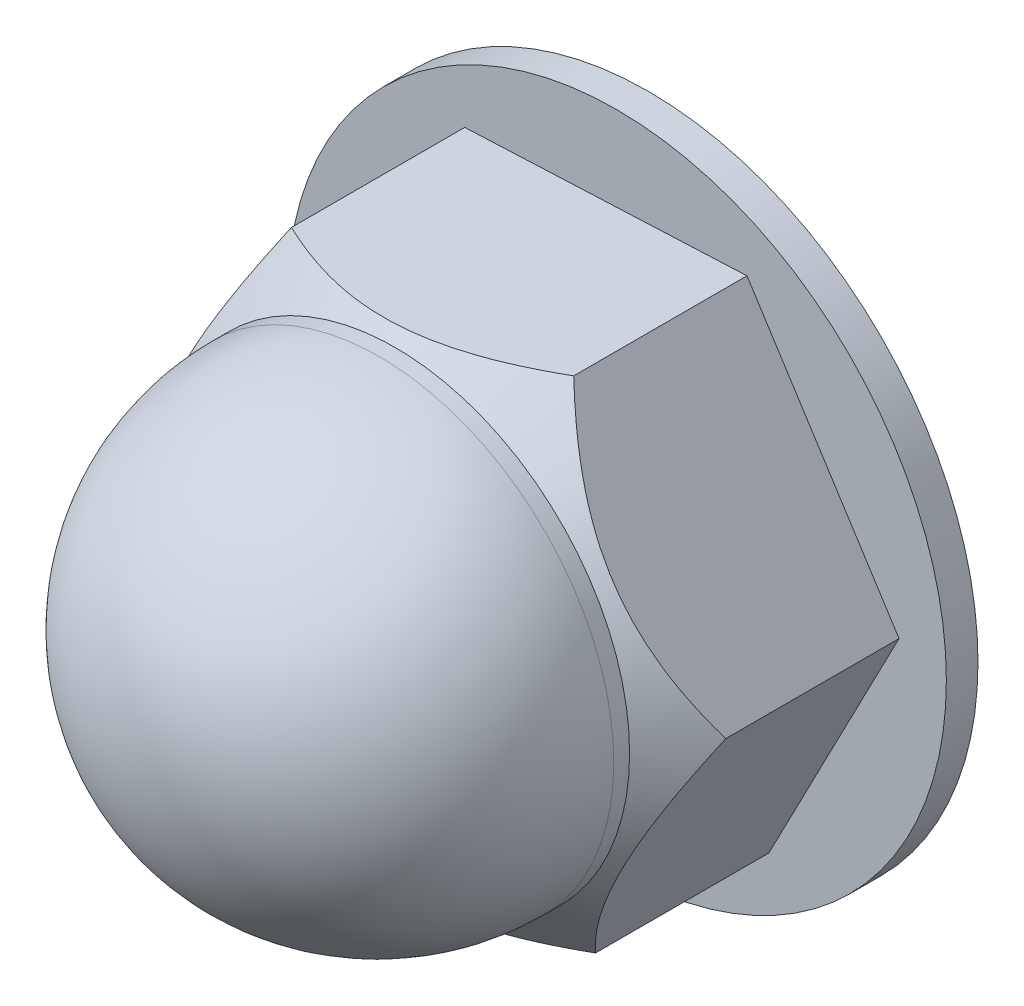
ISO-10303-21;
HEADER;
FILE_DESCRIPTION(('STEP AP214'),'2;1');
FILE_NAME('part.step','',(''),(''),'','','');
FILE_SCHEMA(('AUTOMOTIVE_DESIGN { 1 0 10303 214 1 1 1 1 }'));
ENDSEC;
DATA;
#1=APPLICATION_CONTEXT('core data for automotive mechanical design processes');
#2=APPLICATION_PROTOCOL_DEFINITION('international standard','automotive_design',2000,#1);
#3=PRODUCT_CONTEXT('',#1,'mechanical');
#4=PRODUCT('Part','Part','',(#3));
#5=PRODUCT_RELATED_PRODUCT_CATEGORY('part','',(#4));
#6=PRODUCT_DEFINITION_FORMATION('','',#4);
#7=PRODUCT_DEFINITION_CONTEXT('part definition',#1,'design');
#8=PRODUCT_DEFINITION('design','',#6,#7);
#9=PRODUCT_DEFINITION_SHAPE('','',#8);
#10=(LENGTH_UNIT() NAMED_UNIT(*) SI_UNIT(.MILLI.,.METRE.));
#11=(NAMED_UNIT(*) PLANE_ANGLE_UNIT() SI_UNIT($,.RADIAN.));
#12=(NAMED_UNIT(*) SI_UNIT($,.STERADIAN.) SOLID_ANGLE_UNIT());
#13=UNCERTAINTY_MEASURE_WITH_UNIT(LENGTH_MEASURE(1.E-05),#10,'distance_accuracy_value','');
#14=(GEOMETRIC_REPRESENTATION_CONTEXT(3) GLOBAL_UNCERTAINTY_ASSIGNED_CONTEXT((#13)) GLOBAL_UNIT_ASSIGNED_CONTEXT((#10,
#11,#12)) REPRESENTATION_CONTEXT('',''));
#15=CARTESIAN_POINT('',(0.,0.,0.));
#16=DIRECTION('',(0.,0.,1.));
#17=DIRECTION('',(1.,0.,0.));
#18=AXIS2_PLACEMENT_3D('',#15,#16,#17);
#19=CARTESIAN_POINT('',(92.2559326543257,118.129399506739,16.));
#20=DIRECTION('',(-0.842824038215276,-0.538189223792613,0.));
#21=DIRECTION('',(0.538189223792613,-0.842824038215276,0.));
#22=AXIS2_PLACEMENT_3D('',#19,#20,#21);
#23=PLANE('',#22);
#24=CARTESIAN_POINT('',(92.2560603652593,118.129199506739,12.9518948181768));
#25=CARTESIAN_POINT('',(92.0908191401322,118.387973318038,13.1053873037913));
#26=CARTESIAN_POINT('',(91.9242838044926,118.648773753804,13.2541959734682));
#27=CARTESIAN_POINT('',(91.5884235147349,119.174743270055,13.5409579014863));
#28=CARTESIAN_POINT('',(91.4190970973284,119.439914642104,13.6789052314778));
#29=CARTESIAN_POINT('',(91.0766546254393,119.976192096676,13.9430408864324));
#30=CARTESIAN_POINT('',(90.9035224240984,120.247323465772,14.0691573628248));
#31=CARTESIAN_POINT('',(90.5544143146195,120.794039552971,14.3068921529873));
#32=CARTESIAN_POINT('',(90.378438845875,121.069623582969,14.4185126832892));
#33=CARTESIAN_POINT('',(90.0264740872888,121.620813287308,14.6237242431107));
#34=CARTESIAN_POINT('',(89.8505280407439,121.896351241064,14.7175699027357));
#35=CARTESIAN_POINT('',(89.4961679232253,122.451292165233,14.8874679937733));
#36=CARTESIAN_POINT('',(89.3177541201372,122.730694716129,14.9635223407008));
#37=CARTESIAN_POINT('',(88.9592292806824,123.292157747403,15.0959268965302));
#38=CARTESIAN_POINT('',(88.7791230181467,123.574210751788,15.1523214555356));
#39=CARTESIAN_POINT('',(88.417375896274,124.14071999536,15.2441531198325));
#40=CARTESIAN_POINT('',(88.2357352703561,124.425175869004,15.279593356625));
#41=CARTESIAN_POINT('',(87.9234034024532,124.91429901479,15.3215635846673));
#42=CARTESIAN_POINT('',(87.7929145229036,125.118649379944,15.333449235125));
#43=CARTESIAN_POINT('',(87.5317693061736,125.527612355037,15.345810979035));
#44=CARTESIAN_POINT('',(87.4011129604242,125.732224978394,15.3462864632732));
#45=CARTESIAN_POINT('',(87.1398982771897,126.141296740577,15.3358112799266));
#46=CARTESIAN_POINT('',(87.0093399742779,126.34575582526,15.3248576237133));
#47=CARTESIAN_POINT('',(86.7486330792871,126.754032372453,15.2916977696348));
#48=CARTESIAN_POINT('',(86.6184845345875,126.957849760766,15.269490315368));
#49=CARTESIAN_POINT('',(86.2288056721566,127.568101133186,15.1863810595753));
#50=CARTESIAN_POINT('',(85.9702503425814,127.973008250128,15.1090015050792));
#51=CARTESIAN_POINT('',(85.4576259380617,128.775796844928,14.9145309062929));
#52=CARTESIAN_POINT('',(85.2035565206526,129.173678859098,14.7974429073457));
#53=CARTESIAN_POINT('',(84.7525448849096,129.879979601132,14.5565698588894));
#54=CARTESIAN_POINT('',(84.5546059635394,130.189959202458,14.4391213669472));
#55=CARTESIAN_POINT('',(84.1622831355932,130.804351121723,14.1852991119808));
#56=CARTESIAN_POINT('',(83.967899336656,131.108763271095,14.0489247770066));
#57=CARTESIAN_POINT('',(83.5832963593686,131.711065621452,13.7603079237186));
#58=CARTESIAN_POINT('',(83.3930662447098,132.008972949096,13.6081153103363));
#59=CARTESIAN_POINT('',(83.0161282065559,132.599271724005,13.2898595353694));
#60=CARTESIAN_POINT('',(82.8294182087122,132.891666419775,13.1238048769118));
#61=CARTESIAN_POINT('',(82.6443373641435,133.181509801842,12.9518948181768));
#62=B_SPLINE_CURVE_WITH_KNOTS('',3,(#24,#25,#26,#27,#28,#29,#30,#31,#32,#33,#34,#35,#36,#37,#38,
#39,#40,#41,#42,#43,#44,#45,#46,#47,#48,#49,#50,#51,#52,#53,#54,#55,#56,#57,#58,#59,#60,#61),
.UNSPECIFIED.,.F.,.F.,(4,2,2,2,2,2,2,2,2,2,2,2,2,2,2,2,2,2,4),(0.,1.02982828983487,
2.06021484027422,3.09650089113723,4.13262829956334,5.15255408434797,6.17237000748294,
7.18987023147171,8.2072183575348,8.93521979529388,9.66326010257611,10.3914908342777,
11.1198028853648,12.5775835180413,14.0352523750317,15.1929541840402,16.3506909870977,
17.5048801711571,18.6583664936043),.UNSPECIFIED.);
#63=CARTESIAN_POINT('',(92.2559326543257,118.129399506739,12.9520134680871));
#64=VERTEX_POINT('',#63);
#65=CARTESIAN_POINT('',(82.6444650750771,133.181309801842,12.9520134680871));
#66=VERTEX_POINT('',#65);
#67=EDGE_CURVE('E87',#64,#66,#62,.T.);
#68=ORIENTED_EDGE('',*,*,#67,.F.);
#69=DIRECTION('',(0.,0.,-1.));
#70=VECTOR('',#69,1.);
#71=CARTESIAN_POINT('',(92.2559326543257,118.129399506739,16.));
#72=LINE('',#71,#70);
#73=CARTESIAN_POINT('',(92.2559326543257,118.129399506739,2.));
#74=VERTEX_POINT('',#73);
#75=EDGE_CURVE('E97',#64,#74,#72,.T.);
#76=ORIENTED_EDGE('',*,*,#75,.T.);
#77=DIRECTION('',(-0.538189223792613,0.842824038215276,0.));
#78=VECTOR('',#77,1.);
#79=CARTESIAN_POINT('',(92.2559326543257,118.129399506739,2.));
#80=LINE('',#79,#78);
#81=CARTESIAN_POINT('',(82.6444650750771,133.181309801842,2.));
#82=VERTEX_POINT('',#81);
#83=EDGE_CURVE('E100',#74,#82,#80,.T.);
#84=ORIENTED_EDGE('',*,*,#83,.T.);
#85=DIRECTION('',(0.,0.,-1.));
#86=VECTOR('',#85,1.);
#87=CARTESIAN_POINT('',(82.6444650750771,133.181309801842,16.));
#88=LINE('',#87,#86);
#89=EDGE_CURVE('E99',#66,#82,#88,.T.);
#90=ORIENTED_EDGE('',*,*,#89,.F.);
#91=EDGE_LOOP('',(#68,#76,#84,#90));
#92=FACE_BOUND('',#91,.T.);
#93=ADVANCED_FACE('F32',(#92),#23,.F.);
#94=CARTESIAN_POINT('',(82.6444650750771,133.181309801842,16.));
#95=DIRECTION('',(0.0446735207397933,-0.999001639910922,0.));
#96=DIRECTION('',(0.999001639910922,0.0446735207397933,0.));
#97=AXIS2_PLACEMENT_3D('',#94,#95,#96);
#98=PLANE('',#97);
#99=CARTESIAN_POINT('',(82.6446650750771,133.181318745475,12.9519133673097));
#100=CARTESIAN_POINT('',(82.3379408851219,133.167602602364,13.1054048161147));
#101=CARTESIAN_POINT('',(82.0288145458766,133.153779039543,13.2542124616859));
#102=CARTESIAN_POINT('',(81.4053837371677,133.125900357416,13.5409723793514));
#103=CARTESIAN_POINT('',(81.0910765515464,133.111845116649,13.6789187231605));
#104=CARTESIAN_POINT('',(80.4554278212869,133.083420071484,13.9430524437367));
#105=CARTESIAN_POINT('',(80.1340563050066,133.069048926809,14.0691679731168));
#106=CARTESIAN_POINT('',(79.4860347526251,133.040070591736,14.3069009437252));
#107=CARTESIAN_POINT('',(79.1593855321252,133.02546343781,14.4185206014587));
#108=CARTESIAN_POINT('',(78.5060614164831,132.996247981835,14.6237305420618));
#109=CARTESIAN_POINT('',(78.1794667891593,132.981643269215,14.7175754510528));
#110=CARTESIAN_POINT('',(77.521696368381,132.952228982631,14.8874721545236));
#111=CARTESIAN_POINT('',(77.1905210721711,132.937419430902,14.9635258644811));
#112=CARTESIAN_POINT('',(76.5250200621294,132.907659446547,15.0959292884326));
#113=CARTESIAN_POINT('',(76.1907032094024,132.892709410173,15.1523233516759));
#114=CARTESIAN_POINT('',(75.5192209790774,132.862681956619,15.2441541852588));
#115=CARTESIAN_POINT('',(75.182056034745,132.847604558813,15.2795940870204));
#116=CARTESIAN_POINT('',(74.6022984717679,132.821678864121,15.3215639613534));
#117=CARTESIAN_POINT('',(74.3600814755725,132.810847364381,15.3334495057251));
#118=CARTESIAN_POINT('',(73.8753366486167,132.789170464949,15.3458110418494));
#119=CARTESIAN_POINT('',(73.6328088019506,132.778325064546,15.346286424381));
#120=CARTESIAN_POINT('',(73.147935039398,132.756642399351,15.3358110436337));
#121=CARTESIAN_POINT('',(72.905589187688,132.745805137428,15.3248572917539));
#122=CARTESIAN_POINT('',(72.4216580047502,132.724164622665,15.2916972537349));
#123=CARTESIAN_POINT('',(72.1800727614693,132.713361373756,15.2694897111956));
#124=CARTESIAN_POINT('',(71.4567403471178,132.681015275088,15.1863802041511));
#125=CARTESIAN_POINT('',(70.9768029808247,132.659553356478,15.1090005002181));
#126=CARTESIAN_POINT('',(70.0252557625002,132.61700191042,14.9145296418091));
#127=CARTESIAN_POINT('',(69.5536452747695,132.595912354544,14.7974415327056));
#128=CARTESIAN_POINT('',(68.7164689990687,132.558475367235,14.5565693714911));
#129=CARTESIAN_POINT('',(68.349053040999,132.542045199588,14.4391220832855));
#130=CARTESIAN_POINT('',(67.6208199094126,132.509479949835,14.185302604512));
#131=CARTESIAN_POINT('',(67.2600029356193,132.49334487666,14.0489298422187));
#132=CARTESIAN_POINT('',(66.5460993349473,132.461420417243,13.7603164224897));
#133=CARTESIAN_POINT('',(66.1929924080684,132.445630123222,13.6081256694125));
#134=CARTESIAN_POINT('',(65.4933164107028,132.414341896126,13.2898738374285));
#135=CARTESIAN_POINT('',(65.1467434899964,132.398843790875,13.1238212611334));
#136=CARTESIAN_POINT('',(64.8031945944091,132.38348091448,12.9519133673097));
#137=B_SPLINE_CURVE_WITH_KNOTS('',3,(#99,#100,#101,#102,#103,#104,#105,#106,#107,#108,#109,#110,
#111,#112,#113,#114,#115,#116,#117,#118,#119,#120,#121,#122,#123,#124,#125,#126,#127,#128,#129,
#130,#131,#132,#133,#134,#135,#136),.UNSPECIFIED.,.F.,.F.,(4,2,2,2,2,2,2,2,2,2,2,2,2,2,2,2,2,2,
4),(0.,1.02982389792767,2.0602060500016,3.09648760515516,4.13261051963591,5.15253203954637,
6.1723436996982,7.18983969856086,8.20718360280355,8.93518487167522,9.66322501051785,
10.3914555720774,11.1197674529627,12.5775477216536,14.0352162135011,15.192906323539,
16.3506314142025,17.5048088992358,18.6582835609205),.UNSPECIFIED.);
#138=CARTESIAN_POINT('',(64.8033945944091,132.383489858113,12.9520134680871));
#139=VERTEX_POINT('',#138);
#140=EDGE_CURVE('E101',#66,#139,#137,.T.);
#141=ORIENTED_EDGE('',*,*,#140,.F.);
#142=ORIENTED_EDGE('',*,*,#89,.T.);
#143=DIRECTION('',(-0.999001639910922,-0.0446735207397933,0.));
#144=VECTOR('',#143,1.);
#145=CARTESIAN_POINT('',(82.6444650750771,133.181309801842,2.));
#146=LINE('',#145,#144);
#147=CARTESIAN_POINT('',(64.8033945944091,132.383489858113,2.));
#148=VERTEX_POINT('',#147);
#149=EDGE_CURVE('E207',#82,#148,#146,.T.);
#150=ORIENTED_EDGE('',*,*,#149,.T.);
#151=DIRECTION('',(0.,0.,-1.));
#152=VECTOR('',#151,1.);
#153=CARTESIAN_POINT('',(64.8033945944091,132.383489858113,16.));
#154=LINE('',#153,#152);
#155=EDGE_CURVE('E118',#139,#148,#154,.T.);
#156=ORIENTED_EDGE('',*,*,#155,.F.);
#157=EDGE_LOOP('',(#141,#142,#150,#156));
#158=FACE_BOUND('',#157,.T.);
#159=ADVANCED_FACE('F180',(#158),#98,.F.);
#160=CARTESIAN_POINT('',(64.8033945944091,132.383489858113,16.));
#161=DIRECTION('',(0.887497558955069,-0.460812416118308,0.));
#162=DIRECTION('',(0.460812416118308,0.88749755895507,0.));
#163=AXIS2_PLACEMENT_3D('',#160,#161,#162);
#164=PLANE('',#163);
#165=CARTESIAN_POINT('',(64.8034984397463,132.383689858113,12.9519007906545));
#166=CARTESIAN_POINT('',(64.6620145237929,132.11120017327,13.1053929424352));
#167=CARTESIAN_POINT('',(64.5194225569392,131.836576447687,13.2542012823687));
#168=CARTESIAN_POINT('',(64.2318500805587,131.282728804083,13.5409625630899));
#169=CARTESIAN_POINT('',(64.0868683181297,131.003502473047,13.6789095755486));
#170=CARTESIAN_POINT('',(63.7936600121053,130.438800553654,13.9430446076686));
#171=CARTESIAN_POINT('',(63.6454196432149,130.153298338594,14.0691607791403));
#172=CARTESIAN_POINT('',(63.3465040524323,129.577604525073,14.3068949834396));
#173=CARTESIAN_POINT('',(63.1958292067591,129.287413651187,14.4185152327904));
#174=CARTESIAN_POINT('',(62.8944676785067,128.707009106232,14.6237262712533));
#175=CARTESIAN_POINT('',(62.7438180217932,128.416866744798,14.7175716891879));
#176=CARTESIAN_POINT('',(62.4404055252006,127.832512155677,14.8874693334547));
#177=CARTESIAN_POINT('',(62.2876429146907,127.538300369742,14.9635234752896));
#178=CARTESIAN_POINT('',(61.9806644808272,126.94707799557,15.0959276666755));
#179=CARTESIAN_POINT('',(61.8264527449276,126.650075279527,15.1523220660549));
#180=CARTESIAN_POINT('',(61.5167153144734,126.053539240502,15.2441534628777));
#181=CARTESIAN_POINT('',(61.3611898197767,125.754006302433,15.2795935917968));
#182=CARTESIAN_POINT('',(61.0937628978896,125.238957809658,15.321563705952));
#183=CARTESIAN_POINT('',(60.982034737754,125.023775957089,15.3334493222524));
#184=CARTESIAN_POINT('',(60.7584350363805,124.593136108399,15.3458109992601));
#185=CARTESIAN_POINT('',(60.6465634878057,124.377678098146,15.3462864507511));
#186=CARTESIAN_POINT('',(60.4229043087915,123.946923699024,15.335811203846));
#187=CARTESIAN_POINT('',(60.3111167079548,123.731627367168,15.3248575168303));
#188=CARTESIAN_POINT('',(60.0878923125545,123.301710335665,15.2916976035273));
#189=CARTESIAN_POINT('',(59.9764555585583,123.08708971415,15.2694901208388));
#190=CARTESIAN_POINT('',(59.6428018294674,122.444492293275,15.1863807841492));
#191=CARTESIAN_POINT('',(59.4214196667831,122.018123293426,15.1090011815381));
#192=CARTESIAN_POINT('',(58.9824965967682,121.172783325183,14.9145304991599));
#193=CARTESIAN_POINT('',(58.7649553962089,120.753811792049,14.7974424647454));
#194=CARTESIAN_POINT('',(58.3787874120814,120.010075010504,14.5565697019649));
#195=CARTESIAN_POINT('',(58.2093072146755,119.683666137332,14.4391215976029));
#196=CARTESIAN_POINT('',(57.8733907017516,119.036710728135,14.185300236518));
#197=CARTESIAN_POINT('',(57.7069544783851,118.716164369589,14.0489264079173));
#198=CARTESIAN_POINT('',(57.3776478740921,118.081939254911,13.7603106601704));
#199=CARTESIAN_POINT('',(57.2147681292384,117.768242464406,13.6081186457711));
#200=CARTESIAN_POINT('',(56.8920244169183,117.146657092934,13.28986414037));
#201=CARTESIAN_POINT('',(56.7321586733738,116.838765091343,13.1238101523292));
#202=CARTESIAN_POINT('',(56.5736878476526,116.533559619282,12.9519007906545));
#203=B_SPLINE_CURVE_WITH_KNOTS('',3,(#165,#166,#167,#168,#169,#170,#171,#172,#173,#174,#175,
#176,#177,#178,#179,#180,#181,#182,#183,#184,#185,#186,#187,#188,#189,#190,#191,#192,#193,#194,
#195,#196,#197,#198,#199,#200,#201,#202),.UNSPECIFIED.,.F.,.F.,(4,2,2,2,2,2,2,2,2,2,2,2,2,2,2,2,
2,2,4),(0.,1.02982687571998,2.060212009965,3.09649661329056,4.13262257474722,5.15254698631947,
6.17236153685091,7.18986040042548,8.20720716713878,8.93520855051842,9.6632488035654,
10.3914794804836,11.119791476768,12.5775719922464,14.0352407316659,15.1929387738334,
16.3506718057277,17.5048572229281,18.6583397908366),.UNSPECIFIED.);
#204=CARTESIAN_POINT('',(56.5737916929897,116.533759619282,12.9520134680871));
#205=VERTEX_POINT('',#204);
#206=EDGE_CURVE('E162',#139,#205,#203,.T.);
#207=ORIENTED_EDGE('',*,*,#206,.F.);
#208=ORIENTED_EDGE('',*,*,#155,.T.);
#209=DIRECTION('',(-0.460812416118308,-0.887497558955069,0.));
#210=VECTOR('',#209,1.);
#211=CARTESIAN_POINT('',(64.8033945944091,132.383489858113,2.));
#212=LINE('',#211,#210);
#213=CARTESIAN_POINT('',(56.5737916929897,116.533759619282,2.));
#214=VERTEX_POINT('',#213);
#215=EDGE_CURVE('E210',#148,#214,#212,.T.);
#216=ORIENTED_EDGE('',*,*,#215,.T.);
#217=DIRECTION('',(0.,0.,-1.));
#218=VECTOR('',#217,1.);
#219=CARTESIAN_POINT('',(56.5737916929897,116.533759619282,16.));
#220=LINE('',#219,#218);
#221=EDGE_CURVE('E116',#205,#214,#220,.T.);
#222=ORIENTED_EDGE('',*,*,#221,.F.);
#223=EDGE_LOOP('',(#207,#208,#216,#222));
#224=FACE_BOUND('',#223,.T.);
#225=ADVANCED_FACE('F183',(#224),#164,.F.);
#226=CARTESIAN_POINT('',(56.5737916929897,116.533759619282,16.));
#227=DIRECTION('',(0.842824038215275,0.538189223792613,0.));
#228=DIRECTION('',(-0.538189223792614,0.842824038215276,0.));
#229=AXIS2_PLACEMENT_3D('',#226,#227,#228);
#230=PLANE('',#229);
#231=CARTESIAN_POINT('',(56.5736639820562,116.533959619282,12.9518948181768));
#232=CARTESIAN_POINT('',(56.7389052071832,116.275185807982,13.1053873037913));
#233=CARTESIAN_POINT('',(56.9054405428228,116.014385372217,13.2541959734683));
#234=CARTESIAN_POINT('',(57.2413008325805,115.488415855966,13.5409579014863));
#235=CARTESIAN_POINT('',(57.4106272499871,115.223244483917,13.6789052314778));
#236=CARTESIAN_POINT('',(57.7530697218762,114.686967029344,13.9430408864325));
#237=CARTESIAN_POINT('',(57.9262019232171,114.415835660249,14.0691573628248));
#238=CARTESIAN_POINT('',(58.275310032696,113.86911957305,14.3068921529873));
#239=CARTESIAN_POINT('',(58.4512855014405,113.593535543052,14.4185126832892));
#240=CARTESIAN_POINT('',(58.8032502600266,113.042345838712,14.6237242431107));
#241=CARTESIAN_POINT('',(58.9791963065716,112.766807884957,14.7175699027357));
#242=CARTESIAN_POINT('',(59.3335564240902,112.211866960787,14.8874679937733));
#243=CARTESIAN_POINT('',(59.5119702271783,111.932464409892,14.9635223407008));
#244=CARTESIAN_POINT('',(59.8704950666331,111.371001378618,15.0959268965302));
#245=CARTESIAN_POINT('',(60.0506013291688,111.088948374233,15.1523214555356));
#246=CARTESIAN_POINT('',(60.4123484510415,110.522439130661,15.2441531198325));
#247=CARTESIAN_POINT('',(60.5939890769594,110.237983257016,15.279593356625));
#248=CARTESIAN_POINT('',(60.9063209448623,109.748860111231,15.3215635846673));
#249=CARTESIAN_POINT('',(61.0368098244119,109.544509746076,15.333449235125));
#250=CARTESIAN_POINT('',(61.2979550411419,109.135546770984,15.345810979035));
#251=CARTESIAN_POINT('',(61.4286113868912,108.930934147626,15.3462864632732));
#252=CARTESIAN_POINT('',(61.6898260701257,108.521862385443,15.3358112799266));
#253=CARTESIAN_POINT('',(61.8203843730376,108.31740330076,15.3248576237133));
#254=CARTESIAN_POINT('',(62.0810912680283,107.909126753567,15.2916977696348));
#255=CARTESIAN_POINT('',(62.2112398127279,107.705309365254,15.269490315368));
#256=CARTESIAN_POINT('',(62.6009186751589,107.095057992834,15.1863810595753));
#257=CARTESIAN_POINT('',(62.8594740047341,106.690150875893,15.1090015050792));
#258=CARTESIAN_POINT('',(63.3720984092538,105.887362281093,14.9145309062928));
#259=CARTESIAN_POINT('',(63.6261678266628,105.489480266922,14.7974429073457));
#260=CARTESIAN_POINT('',(64.0771794624059,104.783179524889,14.5565698588894));
#261=CARTESIAN_POINT('',(64.275118383776,104.473199923563,14.4391213669472));
#262=CARTESIAN_POINT('',(64.6674412117223,103.858808004298,14.1852991119808));
#263=CARTESIAN_POINT('',(64.8618250106595,103.554395854925,14.0489247770066));
#264=CARTESIAN_POINT('',(65.2464279879469,102.952093504568,13.7603079237186));
#265=CARTESIAN_POINT('',(65.4366581026057,102.654186176924,13.6081153103363));
#266=CARTESIAN_POINT('',(65.8135961407595,102.063887402016,13.2898595353694));
#267=CARTESIAN_POINT('',(66.0003061386033,101.771492706245,13.1238048769118));
#268=CARTESIAN_POINT('',(66.185386983172,101.481649324179,12.9518948181768));
#269=B_SPLINE_CURVE_WITH_KNOTS('',3,(#231,#232,#233,#234,#235,#236,#237,#238,#239,#240,#241,
#242,#243,#244,#245,#246,#247,#248,#249,#250,#251,#252,#253,#254,#255,#256,#257,#258,#259,#260,
#261,#262,#263,#264,#265,#266,#267,#268),.UNSPECIFIED.,.F.,.F.,(4,2,2,2,2,2,2,2,2,2,2,2,2,2,2,2,
2,2,4),(0.,1.02982828983486,2.0602148402742,3.0965008911372,4.13262829956332,5.15255408434796,
6.17237000748293,7.1898702314717,8.20721835753479,8.93521979529387,9.66326010257609,
10.3914908342777,11.1198028853647,12.5775835180414,14.0352523750317,15.1929541840401,
16.3506909870976,17.5048801711571,18.6583664936043),.UNSPECIFIED.);
#270=CARTESIAN_POINT('',(66.1852592722384,101.481849324179,12.9520134680871));
#271=VERTEX_POINT('',#270);
#272=EDGE_CURVE('E155',#205,#271,#269,.T.);
#273=ORIENTED_EDGE('',*,*,#272,.F.);
#274=ORIENTED_EDGE('',*,*,#221,.T.);
#275=DIRECTION('',(0.538189223792613,-0.842824038215275,0.));
#276=VECTOR('',#275,1.);
#277=CARTESIAN_POINT('',(56.5737916929897,116.533759619282,2.));
#278=LINE('',#277,#276);
#279=CARTESIAN_POINT('',(66.1852592722384,101.481849324179,2.));
#280=VERTEX_POINT('',#279);
#281=EDGE_CURVE('E213',#214,#280,#278,.T.);
#282=ORIENTED_EDGE('',*,*,#281,.T.);
#283=DIRECTION('',(0.,0.,-1.));
#284=VECTOR('',#283,1.);
#285=CARTESIAN_POINT('',(66.1852592722384,101.481849324179,16.));
#286=LINE('',#285,#284);
#287=EDGE_CURVE('E109',#271,#280,#286,.T.);
#288=ORIENTED_EDGE('',*,*,#287,.F.);
#289=EDGE_LOOP('',(#273,#274,#282,#288));
#290=FACE_BOUND('',#289,.T.);
#291=ADVANCED_FACE('F224',(#290),#230,.F.);
#292=CARTESIAN_POINT('',(66.1852592722384,101.481849324179,16.));
#293=DIRECTION('',(-0.0446735207397941,0.999001639910922,0.));
#294=DIRECTION('',(-0.999001639910922,-0.0446735207397941,0.));
#295=AXIS2_PLACEMENT_3D('',#292,#293,#294);
#296=PLANE('',#295);
#297=CARTESIAN_POINT('',(66.1850592722384,101.481840380546,12.9519133673097));
#298=CARTESIAN_POINT('',(66.4917834621936,101.495556523657,13.1054048161147));
#299=CARTESIAN_POINT('',(66.8009098014389,101.509380086478,13.2542124616858));
#300=CARTESIAN_POINT('',(67.4243406101478,101.537258768604,13.5409723793514));
#301=CARTESIAN_POINT('',(67.7386477957691,101.551314009371,13.6789187231605));
#302=CARTESIAN_POINT('',(68.3742965260286,101.579739054536,13.9430524437366));
#303=CARTESIAN_POINT('',(68.6956680423089,101.594110199211,14.0691679731168));
#304=CARTESIAN_POINT('',(69.3436895946904,101.623088534285,14.3069009437252));
#305=CARTESIAN_POINT('',(69.6703388151902,101.637695688211,14.4185206014587));
#306=CARTESIAN_POINT('',(70.3236629308324,101.666911144186,14.6237305420618));
#307=CARTESIAN_POINT('',(70.6502575581561,101.681515856805,14.7175754510527));
#308=CARTESIAN_POINT('',(71.3080279789344,101.71093014339,14.8874721545236));
#309=CARTESIAN_POINT('',(71.6392032751443,101.725739695119,14.963525864481));
#310=CARTESIAN_POINT('',(72.304704285186,101.755499679474,15.0959292884325));
#311=CARTESIAN_POINT('',(72.639021137913,101.770449715848,15.1523233516759));
#312=CARTESIAN_POINT('',(73.310503368238,101.800477169402,15.2441541852588));
#313=CARTESIAN_POINT('',(73.6476683125705,101.815554567207,15.2795940870204));
#314=CARTESIAN_POINT('',(74.2274258755475,101.8414802619,15.3215639613534));
#315=CARTESIAN_POINT('',(74.4696428717429,101.85231176164,15.3334495057251));
#316=CARTESIAN_POINT('',(74.9543876986987,101.873988661072,15.3458110418494));
#317=CARTESIAN_POINT('',(75.1969155453648,101.884834061475,15.346286424381));
#318=CARTESIAN_POINT('',(75.6817893079175,101.90651672667,15.3358110436337));
#319=CARTESIAN_POINT('',(75.9241351596275,101.917353988592,15.3248572917538));
#320=CARTESIAN_POINT('',(76.4080663425653,101.938994503356,15.2916972537349));
#321=CARTESIAN_POINT('',(76.6496515858462,101.949797752265,15.2694897111955));
#322=CARTESIAN_POINT('',(77.3729840001977,101.982143850933,15.1863802041511));
#323=CARTESIAN_POINT('',(77.8529213664908,102.003605769543,15.109000500218));
#324=CARTESIAN_POINT('',(78.8044685848153,102.046157215601,14.9145296418091));
#325=CARTESIAN_POINT('',(79.276079072546,102.067246771477,14.7974415327056));
#326=CARTESIAN_POINT('',(80.1132553482468,102.104683758786,14.5565693714911));
#327=CARTESIAN_POINT('',(80.4806713063164,102.121113926432,14.4391220832855));
#328=CARTESIAN_POINT('',(81.2089044379029,102.153679176185,14.185302604512));
#329=CARTESIAN_POINT('',(81.5697214116962,102.169814249361,14.0489298422187));
#330=CARTESIAN_POINT('',(82.2836250123682,102.201738708778,13.7603164224897));
#331=CARTESIAN_POINT('',(82.636731939247,102.217529002798,13.6081256694125));
#332=CARTESIAN_POINT('',(83.3364079366127,102.248817229895,13.2898738374285));
#333=CARTESIAN_POINT('',(83.682980857319,102.264315335146,13.1238212611334));
#334=CARTESIAN_POINT('',(84.0265297529063,102.27967821154,12.9519133673097));
#335=B_SPLINE_CURVE_WITH_KNOTS('',3,(#297,#298,#299,#300,#301,#302,#303,#304,#305,#306,#307,
#308,#309,#310,#311,#312,#313,#314,#315,#316,#317,#318,#319,#320,#321,#322,#323,#324,#325,#326,
#327,#328,#329,#330,#331,#332,#333,#334),.UNSPECIFIED.,.F.,.F.,(4,2,2,2,2,2,2,2,2,2,2,2,2,2,2,2,
2,2,4),(0.,1.02982389792766,2.06020605000158,3.09648760515515,4.1326105196359,5.15253203954634,
6.17234369969819,7.18983969856084,8.20718360280354,8.9351848716752,9.66322501051783,
10.3914555720774,11.1197674529627,12.5775477216537,14.0352162135011,15.192906323539,
16.3506314142024,17.5048088992358,18.6582835609205),.UNSPECIFIED.);
#336=CARTESIAN_POINT('',(84.0263297529063,102.279669267907,12.9520134680871));
#337=VERTEX_POINT('',#336);
#338=EDGE_CURVE('E52',#271,#337,#335,.T.);
#339=ORIENTED_EDGE('',*,*,#338,.F.);
#340=ORIENTED_EDGE('',*,*,#287,.T.);
#341=DIRECTION('',(0.999001639910922,0.0446735207397941,0.));
#342=VECTOR('',#341,1.);
#343=CARTESIAN_POINT('',(66.1852592722384,101.481849324179,2.));
#344=LINE('',#343,#342);
#345=CARTESIAN_POINT('',(84.0263297529063,102.279669267907,2.));
#346=VERTEX_POINT('',#345);
#347=EDGE_CURVE('E111',#280,#346,#344,.T.);
#348=ORIENTED_EDGE('',*,*,#347,.T.);
#349=DIRECTION('',(0.,0.,-1.));
#350=VECTOR('',#349,1.);
#351=CARTESIAN_POINT('',(84.0263297529063,102.279669267907,16.));
#352=LINE('',#351,#350);
#353=EDGE_CURVE('E107',#337,#346,#352,.T.);
#354=ORIENTED_EDGE('',*,*,#353,.F.);
#355=EDGE_LOOP('',(#339,#340,#348,#354));
#356=FACE_BOUND('',#355,.T.);
#357=ADVANCED_FACE('F220',(#356),#296,.F.);
#358=CARTESIAN_POINT('',(84.0263297529063,102.279669267907,16.));
#359=DIRECTION('',(-0.887497558955069,0.460812416118309,0.));
#360=DIRECTION('',(-0.460812416118309,-0.887497558955069,0.));
#361=AXIS2_PLACEMENT_3D('',#358,#359,#360);
#362=PLANE('',#361);
#363=CARTESIAN_POINT('',(84.0262259075692,102.279469267907,12.9519007906545));
#364=CARTESIAN_POINT('',(84.1677098235225,102.551958952751,13.1053929424351));
#365=CARTESIAN_POINT('',(84.3103017903762,102.826582678334,13.2542012823687));
#366=CARTESIAN_POINT('',(84.5978742667568,103.380430321937,13.5409625630899));
#367=CARTESIAN_POINT('',(84.7428560291858,103.659656652974,13.6789095755486));
#368=CARTESIAN_POINT('',(85.0360643352101,104.224358572366,13.9430446076686));
#369=CARTESIAN_POINT('',(85.1843047041006,104.509860787426,14.0691607791403));
#370=CARTESIAN_POINT('',(85.4832202948832,105.085554600948,14.3068949834395));
#371=CARTESIAN_POINT('',(85.6338951405564,105.375745474834,14.4185152327904));
#372=CARTESIAN_POINT('',(85.9352566688088,105.956150019789,14.6237262712533));
#373=CARTESIAN_POINT('',(86.0859063255222,106.246292381223,14.7175716891879));
#374=CARTESIAN_POINT('',(86.3893188221149,106.830646970343,14.8874693334547));
#375=CARTESIAN_POINT('',(86.5420814326248,107.124858756278,14.9635234752896));
#376=CARTESIAN_POINT('',(86.8490598664883,107.716081130451,15.0959276666755));
#377=CARTESIAN_POINT('',(87.0032716023879,108.013083846493,15.1523220660548));
#378=CARTESIAN_POINT('',(87.313009032842,108.609619885519,15.2441534628777));
#379=CARTESIAN_POINT('',(87.4685345275387,108.909152823588,15.2795935917967));
#380=CARTESIAN_POINT('',(87.7359614494259,109.424201316363,15.321563705952));
#381=CARTESIAN_POINT('',(87.8476896095615,109.639383168931,15.3334493222524));
#382=CARTESIAN_POINT('',(88.0712893109349,110.070023017622,15.3458109992601));
#383=CARTESIAN_POINT('',(88.1831608595097,110.285481027875,15.3462864507511));
#384=CARTESIAN_POINT('',(88.4068200385239,110.716235426997,15.335811203846));
#385=CARTESIAN_POINT('',(88.5186076393606,110.931531758853,15.3248575168303));
#386=CARTESIAN_POINT('',(88.7418320347609,111.361448790355,15.2916976035273));
#387=CARTESIAN_POINT('',(88.8532687887571,111.576069411871,15.2694901208388));
#388=CARTESIAN_POINT('',(89.1869225178481,112.218666832745,15.1863807841491));
#389=CARTESIAN_POINT('',(89.4083046805324,112.645035832595,15.1090011815381));
#390=CARTESIAN_POINT('',(89.8472277505473,113.490375800837,14.9145304991599));
#391=CARTESIAN_POINT('',(90.0647689511065,113.909347333972,14.7974424647454));
#392=CARTESIAN_POINT('',(90.4509369352341,114.653084115517,14.5565697019649));
#393=CARTESIAN_POINT('',(90.6204171326399,114.979492988689,14.4391215976029));
#394=CARTESIAN_POINT('',(90.9563336455639,115.626448397886,14.185300236518));
#395=CARTESIAN_POINT('',(91.1227698689303,115.946994756431,14.0489264079173));
#396=CARTESIAN_POINT('',(91.4520764732234,116.58121987111,13.7603106601704));
#397=CARTESIAN_POINT('',(91.6149562180771,116.894916661614,13.6081186457711));
#398=CARTESIAN_POINT('',(91.9376999303971,117.516502033087,13.28986414037));
#399=CARTESIAN_POINT('',(92.0975656739417,117.824394034677,13.1238101523292));
#400=CARTESIAN_POINT('',(92.2560364996629,118.129599506739,12.9519007906545));
#401=B_SPLINE_CURVE_WITH_KNOTS('',3,(#363,#364,#365,#366,#367,#368,#369,#370,#371,#372,#373,
#374,#375,#376,#377,#378,#379,#380,#381,#382,#383,#384,#385,#386,#387,#388,#389,#390,#391,#392,
#393,#394,#395,#396,#397,#398,#399,#400),.UNSPECIFIED.,.F.,.F.,(4,2,2,2,2,2,2,2,2,2,2,2,2,2,2,2,
2,2,4),(0.,1.02982687571999,2.06021200996499,3.09649661329054,4.13262257474721,5.15254698631944,
6.17236153685088,7.18986040042545,8.20720716713871,8.93520855051837,9.66324880356535,
10.3914794804836,11.119791476768,12.5775719922463,14.0352407316658,15.1929387738333,
16.3506718057277,17.5048572229281,18.6583397908366),.UNSPECIFIED.);
#402=EDGE_CURVE('E84',#337,#64,#401,.T.);
#403=ORIENTED_EDGE('',*,*,#402,.F.);
#404=ORIENTED_EDGE('',*,*,#353,.T.);
#405=DIRECTION('',(0.460812416118309,0.887497558955069,0.));
#406=VECTOR('',#405,1.);
#407=CARTESIAN_POINT('',(84.0263297529063,102.279669267907,2.));
#408=LINE('',#407,#406);
#409=EDGE_CURVE('E105',#346,#74,#408,.T.);
#410=ORIENTED_EDGE('',*,*,#409,.T.);
#411=ORIENTED_EDGE('',*,*,#75,.F.);
#412=EDGE_LOOP('',(#403,#404,#410,#411));
#413=FACE_BOUND('',#412,.T.);
#414=ADVANCED_FACE('F103',(#413),#362,.F.);
#415=CARTESIAN_POINT('',(74.4148621736577,117.33157956301,2.));
#416=DIRECTION('',(0.,0.,1.));
#417=DIRECTION('',(1.,0.,0.));
#418=AXIS2_PLACEMENT_3D('',#415,#416,#417);
#419=PLANE('',#418);
#420=CARTESIAN_POINT('',(74.4148621736577,117.33157956301,2.));
#421=DIRECTION('',(0.,0.,1.));
#422=DIRECTION('',(1.,0.,0.));
#423=AXIS2_PLACEMENT_3D('',#420,#421,#422);
#424=CIRCLE('',#423,20.8312878014326);
#425=CARTESIAN_POINT('',(95.2461499750903,117.33157956301,2.));
#426=VERTEX_POINT('',#425);
#427=EDGE_CURVE('E11',#426,#426,#424,.T.);
#428=ORIENTED_EDGE('',*,*,#427,.T.);
#429=EDGE_LOOP('',(#428));
#430=FACE_BOUND('',#429,.T.);
#431=ORIENTED_EDGE('',*,*,#149,.F.);
#432=ORIENTED_EDGE('',*,*,#83,.F.);
#433=ORIENTED_EDGE('',*,*,#409,.F.);
#434=ORIENTED_EDGE('',*,*,#347,.F.);
#435=ORIENTED_EDGE('',*,*,#281,.F.);
#436=ORIENTED_EDGE('',*,*,#215,.F.);
#437=EDGE_LOOP('',(#431,#432,#433,#434,#435,#436));
#438=FACE_BOUND('',#437,.T.);
#439=ADVANCED_FACE('F189',(#430,#438),#419,.T.);
#440=CARTESIAN_POINT('',(74.4148621736577,117.33157956301,2.));
#441=DIRECTION('',(0.,0.,-1.));
#442=DIRECTION('',(-1.,0.,0.));
#443=AXIS2_PLACEMENT_3D('',#440,#441,#442);
#444=CYLINDRICAL_SURFACE('',#443,20.8312878014326);
#445=ORIENTED_EDGE('',*,*,#427,.F.);
#446=EDGE_LOOP('',(#445));
#447=FACE_BOUND('',#446,.T.);
#448=CARTESIAN_POINT('',(74.4148621736577,117.33157956301,0.));
#449=DIRECTION('',(0.,0.,1.));
#450=DIRECTION('',(1.,0.,0.));
#451=AXIS2_PLACEMENT_3D('',#448,#449,#450);
#452=CIRCLE('',#451,20.8312878014326);
#453=CARTESIAN_POINT('',(95.2461499750903,117.33157956301,0.));
#454=VERTEX_POINT('',#453);
#455=EDGE_CURVE('E41',#454,#454,#452,.T.);
#456=ORIENTED_EDGE('',*,*,#455,.T.);
#457=EDGE_LOOP('',(#456));
#458=FACE_BOUND('',#457,.T.);
#459=ADVANCED_FACE('F192',(#447,#458),#444,.T.);
#460=CARTESIAN_POINT('',(74.4148621736577,117.33157956301,0.));
#461=DIRECTION('',(0.,0.,1.));
#462=DIRECTION('',(1.,0.,0.));
#463=AXIS2_PLACEMENT_3D('',#460,#461,#462);
#464=PLANE('',#463);
#465=ORIENTED_EDGE('',*,*,#455,.F.);
#466=EDGE_LOOP('',(#465));
#467=FACE_BOUND('',#466,.T.);
#468=ADVANCED_FACE('F148',(#467),#464,.F.);
#469=CARTESIAN_POINT('',(74.4148621736577,117.33157956301,16.));
#470=DIRECTION('',(0.,0.,-1.));
#471=DIRECTION('',(1.,0.,0.));
#472=AXIS2_PLACEMENT_3D('',#469,#470,#471);
#473=CONICAL_SURFACE('',#472,14.8109135618435,0.78539816339745);
#474=CARTESIAN_POINT('',(74.4148621736577,117.33157956301,16.));
#475=DIRECTION('',(0.,0.,1.));
#476=DIRECTION('',(1.,0.,0.));
#477=AXIS2_PLACEMENT_3D('',#474,#475,#476);
#478=CIRCLE('',#477,14.8109135618435);
#479=CARTESIAN_POINT('',(89.2257757355012,117.33157956301,16.));
#480=VERTEX_POINT('',#479);
#481=EDGE_CURVE('E92',#480,#480,#478,.T.);
#482=ORIENTED_EDGE('',*,*,#481,.F.);
#483=EDGE_LOOP('',(#482));
#484=FACE_BOUND('',#483,.T.);
#485=ORIENTED_EDGE('',*,*,#67,.T.);
#486=ORIENTED_EDGE('',*,*,#140,.T.);
#487=ORIENTED_EDGE('',*,*,#206,.T.);
#488=ORIENTED_EDGE('',*,*,#272,.T.);
#489=ORIENTED_EDGE('',*,*,#338,.T.);
#490=ORIENTED_EDGE('',*,*,#402,.T.);
#491=EDGE_LOOP('',(#485,#486,#487,#488,#489,#490));
#492=FACE_BOUND('',#491,.T.);
#493=ADVANCED_FACE('F86',(#484,#492),#473,.T.);
#494=CARTESIAN_POINT('',(74.4148621736577,117.33157956301,17.));
#495=DIRECTION('',(0.,0.,-1.));
#496=DIRECTION('',(-1.,0.,0.));
#497=AXIS2_PLACEMENT_3D('',#494,#495,#496);
#498=CYLINDRICAL_SURFACE('',#497,14.8109135618435);
#499=CARTESIAN_POINT('',(74.4148621736577,117.33157956301,17.));
#500=DIRECTION('',(0.,0.,1.));
#501=DIRECTION('',(1.,0.,0.));
#502=AXIS2_PLACEMENT_3D('',#499,#500,#501);
#503=CIRCLE('',#502,14.8109135618435);
#504=CARTESIAN_POINT('',(89.2257757355012,117.33157956301,17.));
#505=VERTEX_POINT('',#504);
#506=EDGE_CURVE('E122',#505,#505,#503,.T.);
#507=ORIENTED_EDGE('',*,*,#506,.F.);
#508=EDGE_LOOP('',(#507));
#509=FACE_BOUND('',#508,.T.);
#510=ORIENTED_EDGE('',*,*,#481,.T.);
#511=EDGE_LOOP('',(#510));
#512=FACE_BOUND('',#511,.T.);
#513=ADVANCED_FACE('F147',(#509,#512),#498,.T.);
#514=CARTESIAN_POINT('',(74.4148621736577,117.33157956301,17.));
#515=DIRECTION('',(0.,1.,0.));
#516=DIRECTION('',(0.,0.,1.));
#517=AXIS2_PLACEMENT_3D('',#514,#515,#516);
#518=ELLIPSE('',#517,15.,14.8109135618435);
#519=TRIMMED_CURVE('',#518,(PARAMETER_VALUE(0.)),(PARAMETER_VALUE(3.14159265358979)),.T.,.PARAMETER.);
#520=CARTESIAN_POINT('',(74.4148621736577,117.33157956301,2.));
#521=DIRECTION('',(0.,0.,1.));
#522=AXIS1_PLACEMENT('',#520,#521);
#523=SURFACE_OF_REVOLUTION('',#519,#522);
#524=CARTESIAN_POINT('',(74.4148621736577,117.33157956301,32.));
#525=VERTEX_POINT('',#524);
#526=VERTEX_LOOP('',#525);
#527=FACE_BOUND('',#526,.T.);
#528=ORIENTED_EDGE('',*,*,#506,.T.);
#529=EDGE_LOOP('',(#528));
#530=FACE_BOUND('',#529,.T.);
#531=ADVANCED_FACE('F34',(#527,#530),#523,.F.);
#532=CLOSED_SHELL('',(#93,#159,#225,#291,#357,#414,#439,#459,#468,#493,#513,#531));
#533=MANIFOLD_SOLID_BREP('B2',#532);
#534=ADVANCED_BREP_SHAPE_REPRESENTATION('',(#18,#533),#14);
#535=SHAPE_DEFINITION_REPRESENTATION(#9,#534);
ENDSEC;
END-ISO-10303-21;
